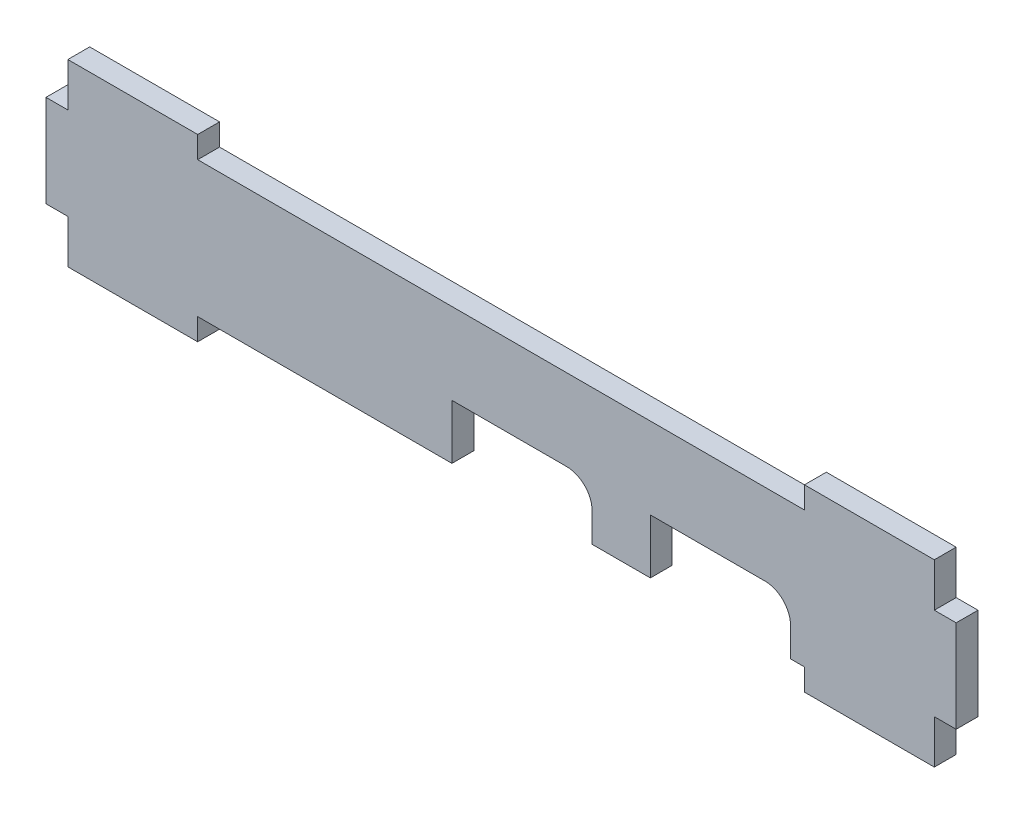
ISO-10303-21;
HEADER;
FILE_DESCRIPTION(('STEP AP214'),'2;1');
FILE_NAME('part.step','',(''),(''),'','','');
FILE_SCHEMA(('AUTOMOTIVE_DESIGN { 1 0 10303 214 1 1 1 1 }'));
ENDSEC;
DATA;
#1=APPLICATION_CONTEXT('core data for automotive mechanical design processes');
#2=APPLICATION_PROTOCOL_DEFINITION('international standard','automotive_design',2000,#1);
#3=PRODUCT_CONTEXT('',#1,'mechanical');
#4=PRODUCT('Part','Part','',(#3));
#5=PRODUCT_RELATED_PRODUCT_CATEGORY('part','',(#4));
#6=PRODUCT_DEFINITION_FORMATION('','',#4);
#7=PRODUCT_DEFINITION_CONTEXT('part definition',#1,'design');
#8=PRODUCT_DEFINITION('design','',#6,#7);
#9=PRODUCT_DEFINITION_SHAPE('','',#8);
#10=(LENGTH_UNIT() NAMED_UNIT(*) SI_UNIT(.MILLI.,.METRE.));
#11=(NAMED_UNIT(*) PLANE_ANGLE_UNIT() SI_UNIT($,.RADIAN.));
#12=(NAMED_UNIT(*) SI_UNIT($,.STERADIAN.) SOLID_ANGLE_UNIT());
#13=UNCERTAINTY_MEASURE_WITH_UNIT(LENGTH_MEASURE(1.E-05),#10,'distance_accuracy_value','');
#14=(GEOMETRIC_REPRESENTATION_CONTEXT(3) GLOBAL_UNCERTAINTY_ASSIGNED_CONTEXT((#13)) GLOBAL_UNIT_ASSIGNED_CONTEXT((#10,
#11,#12)) REPRESENTATION_CONTEXT('',''));
#15=CARTESIAN_POINT('',(0.,0.,0.));
#16=DIRECTION('',(0.,0.,1.));
#17=DIRECTION('',(1.,0.,0.));
#18=AXIS2_PLACEMENT_3D('',#15,#16,#17);
#19=CARTESIAN_POINT('',(166.666666666667,30.6625,3.));
#20=DIRECTION('',(0.,1.,0.));
#21=DIRECTION('',(0.,0.,1.));
#22=AXIS2_PLACEMENT_3D('',#19,#20,#21);
#23=PLANE('',#22);
#24=DIRECTION('',(-1.,0.,0.));
#25=VECTOR('',#24,1.);
#26=CARTESIAN_POINT('',(166.666666666667,30.6625,9.));
#27=LINE('',#26,#25);
#28=CARTESIAN_POINT('',(291.003333333333,30.6625,9.));
#29=VERTEX_POINT('',#28);
#30=CARTESIAN_POINT('',(275.003333333333,30.6625,9.));
#31=VERTEX_POINT('',#30);
#32=EDGE_CURVE('E355',#29,#31,#27,.T.);
#33=ORIENTED_EDGE('',*,*,#32,.T.);
#34=DIRECTION('',(0.,0.,1.));
#35=VECTOR('',#34,1.);
#36=CARTESIAN_POINT('',(275.003333333333,30.6625,3.));
#37=LINE('',#36,#35);
#38=CARTESIAN_POINT('',(275.003333333333,30.6625,3.));
#39=VERTEX_POINT('',#38);
#40=EDGE_CURVE('E264',#39,#31,#37,.T.);
#41=ORIENTED_EDGE('',*,*,#40,.F.);
#42=DIRECTION('',(-1.,0.,0.));
#43=VECTOR('',#42,1.);
#44=CARTESIAN_POINT('',(166.666666666667,30.6625,3.));
#45=LINE('',#44,#43);
#46=CARTESIAN_POINT('',(291.003333333333,30.6625,3.));
#47=VERTEX_POINT('',#46);
#48=EDGE_CURVE('E347',#47,#39,#45,.T.);
#49=ORIENTED_EDGE('',*,*,#48,.F.);
#50=DIRECTION('',(0.,0.,1.));
#51=VECTOR('',#50,1.);
#52=CARTESIAN_POINT('',(291.003333333333,30.6625,3.));
#53=LINE('',#52,#51);
#54=EDGE_CURVE('E284',#47,#29,#53,.T.);
#55=ORIENTED_EDGE('',*,*,#54,.T.);
#56=EDGE_LOOP('',(#33,#41,#49,#55));
#57=FACE_BOUND('',#56,.T.);
#58=ADVANCED_FACE('F34',(#57),#23,.F.);
#59=CARTESIAN_POINT('',(333.333333333333,30.6625,9.));
#60=VERTEX_POINT('',#59);
#61=CARTESIAN_POINT('',(329.503333333333,30.6625,9.));
#62=VERTEX_POINT('',#61);
#63=EDGE_CURVE('E339',#60,#62,#27,.T.);
#64=ORIENTED_EDGE('',*,*,#63,.T.);
#65=DIRECTION('',(0.,0.,1.));
#66=VECTOR('',#65,1.);
#67=CARTESIAN_POINT('',(329.503333333333,30.6625,3.));
#68=LINE('',#67,#66);
#69=CARTESIAN_POINT('',(329.503333333333,30.6625,3.));
#70=VERTEX_POINT('',#69);
#71=EDGE_CURVE('E281',#70,#62,#68,.T.);
#72=ORIENTED_EDGE('',*,*,#71,.F.);
#73=CARTESIAN_POINT('',(333.333333333333,30.6625,3.));
#74=VERTEX_POINT('',#73);
#75=EDGE_CURVE('E343',#74,#70,#45,.T.);
#76=ORIENTED_EDGE('',*,*,#75,.F.);
#77=DIRECTION('',(0.,0.,1.));
#78=VECTOR('',#77,1.);
#79=CARTESIAN_POINT('',(333.333333333333,30.6625,3.));
#80=LINE('',#79,#78);
#81=EDGE_CURVE('E358',#74,#60,#80,.T.);
#82=ORIENTED_EDGE('',*,*,#81,.T.);
#83=EDGE_LOOP('',(#64,#72,#76,#82));
#84=FACE_BOUND('',#83,.T.);
#85=ADVANCED_FACE('F473',(#84),#23,.F.);
#86=CARTESIAN_POINT('',(125.,24.6625,9.));
#87=DIRECTION('',(0.,1.,0.));
#88=DIRECTION('',(0.,0.,1.));
#89=AXIS2_PLACEMENT_3D('',#86,#87,#88);
#90=PLANE('',#89);
#91=DIRECTION('',(1.,0.,0.));
#92=VECTOR('',#91,1.);
#93=CARTESIAN_POINT('',(125.,24.6625,3.));
#94=LINE('',#93,#92);
#95=CARTESIAN_POINT('',(131.,24.6625,3.));
#96=VERTEX_POINT('',#95);
#97=CARTESIAN_POINT('',(166.666666666667,24.6625,3.));
#98=VERTEX_POINT('',#97);
#99=EDGE_CURVE('E439',#96,#98,#94,.T.);
#100=ORIENTED_EDGE('',*,*,#99,.T.);
#101=DIRECTION('',(0.,0.,1.));
#102=VECTOR('',#101,1.);
#103=CARTESIAN_POINT('',(166.666666666667,24.6625,3.));
#104=LINE('',#103,#102);
#105=CARTESIAN_POINT('',(166.666666666667,24.6625,9.));
#106=VERTEX_POINT('',#105);
#107=EDGE_CURVE('E346',#98,#106,#104,.T.);
#108=ORIENTED_EDGE('',*,*,#107,.T.);
#109=DIRECTION('',(1.,0.,0.));
#110=VECTOR('',#109,1.);
#111=CARTESIAN_POINT('',(125.,24.6625,9.));
#112=LINE('',#111,#110);
#113=CARTESIAN_POINT('',(131.,24.6625,9.));
#114=VERTEX_POINT('',#113);
#115=EDGE_CURVE('E426',#114,#106,#112,.T.);
#116=ORIENTED_EDGE('',*,*,#115,.F.);
#117=DIRECTION('',(0.,0.,1.));
#118=VECTOR('',#117,1.);
#119=CARTESIAN_POINT('',(131.,24.6625,3.));
#120=LINE('',#119,#118);
#121=EDGE_CURVE('E391',#96,#114,#120,.T.);
#122=ORIENTED_EDGE('',*,*,#121,.F.);
#123=EDGE_LOOP('',(#100,#108,#116,#122));
#124=FACE_BOUND('',#123,.T.);
#125=ADVANCED_FACE('F480',(#124),#90,.F.);
#126=CARTESIAN_POINT('',(125.,73.9875,9.));
#127=DIRECTION('',(0.,-1.,0.));
#128=DIRECTION('',(0.,0.,-1.));
#129=AXIS2_PLACEMENT_3D('',#126,#127,#128);
#130=PLANE('',#129);
#131=DIRECTION('',(-1.,0.,0.));
#132=VECTOR('',#131,1.);
#133=CARTESIAN_POINT('',(125.,73.9875,9.));
#134=LINE('',#133,#132);
#135=CARTESIAN_POINT('',(166.666666666667,73.9875,9.));
#136=VERTEX_POINT('',#135);
#137=CARTESIAN_POINT('',(131.,73.9875,9.));
#138=VERTEX_POINT('',#137);
#139=EDGE_CURVE('E429',#136,#138,#134,.T.);
#140=ORIENTED_EDGE('',*,*,#139,.F.);
#141=DIRECTION('',(0.,0.,1.));
#142=VECTOR('',#141,1.);
#143=CARTESIAN_POINT('',(166.666666666667,73.9875,3.));
#144=LINE('',#143,#142);
#145=CARTESIAN_POINT('',(166.666666666667,73.9875,3.));
#146=VERTEX_POINT('',#145);
#147=EDGE_CURVE('E300',#146,#136,#144,.T.);
#148=ORIENTED_EDGE('',*,*,#147,.F.);
#149=DIRECTION('',(-1.,0.,0.));
#150=VECTOR('',#149,1.);
#151=CARTESIAN_POINT('',(125.,73.9875,3.));
#152=LINE('',#151,#150);
#153=CARTESIAN_POINT('',(131.,73.9875,3.));
#154=VERTEX_POINT('',#153);
#155=EDGE_CURVE('E442',#146,#154,#152,.T.);
#156=ORIENTED_EDGE('',*,*,#155,.T.);
#157=DIRECTION('',(0.,0.,1.));
#158=VECTOR('',#157,1.);
#159=CARTESIAN_POINT('',(131.,73.9875,3.));
#160=LINE('',#159,#158);
#161=EDGE_CURVE('E302',#154,#138,#160,.T.);
#162=ORIENTED_EDGE('',*,*,#161,.T.);
#163=EDGE_LOOP('',(#140,#148,#156,#162));
#164=FACE_BOUND('',#163,.T.);
#165=ADVANCED_FACE('F535',(#164),#130,.F.);
#166=CARTESIAN_POINT('',(125.,24.6625,9.));
#167=DIRECTION('',(1.,0.,0.));
#168=DIRECTION('',(0.,0.,-1.));
#169=AXIS2_PLACEMENT_3D('',#166,#167,#168);
#170=PLANE('',#169);
#171=DIRECTION('',(0.,-1.,0.));
#172=VECTOR('',#171,1.);
#173=CARTESIAN_POINT('',(125.,24.6625,9.));
#174=LINE('',#173,#172);
#175=CARTESIAN_POINT('',(125.,61.9875,9.));
#176=VERTEX_POINT('',#175);
#177=CARTESIAN_POINT('',(125.,36.6625,9.));
#178=VERTEX_POINT('',#177);
#179=EDGE_CURVE('E419',#176,#178,#174,.T.);
#180=ORIENTED_EDGE('',*,*,#179,.F.);
#181=DIRECTION('',(0.,0.,1.));
#182=VECTOR('',#181,1.);
#183=CARTESIAN_POINT('',(125.,61.9875,3.));
#184=LINE('',#183,#182);
#185=CARTESIAN_POINT('',(125.,61.9875,3.));
#186=VERTEX_POINT('',#185);
#187=EDGE_CURVE('E296',#186,#176,#184,.T.);
#188=ORIENTED_EDGE('',*,*,#187,.F.);
#189=DIRECTION('',(0.,-1.,0.));
#190=VECTOR('',#189,1.);
#191=CARTESIAN_POINT('',(125.,24.6625,3.));
#192=LINE('',#191,#190);
#193=CARTESIAN_POINT('',(125.,36.6625,3.));
#194=VERTEX_POINT('',#193);
#195=EDGE_CURVE('E415',#186,#194,#192,.T.);
#196=ORIENTED_EDGE('',*,*,#195,.T.);
#197=DIRECTION('',(0.,0.,1.));
#198=VECTOR('',#197,1.);
#199=CARTESIAN_POINT('',(125.,36.6625,3.));
#200=LINE('',#199,#198);
#201=EDGE_CURVE('E375',#194,#178,#200,.T.);
#202=ORIENTED_EDGE('',*,*,#201,.T.);
#203=EDGE_LOOP('',(#180,#188,#196,#202));
#204=FACE_BOUND('',#203,.T.);
#205=ADVANCED_FACE('F521',(#204),#170,.F.);
#206=CARTESIAN_POINT('',(333.333333333333,24.6625,9.));
#207=VERTEX_POINT('',#206);
#208=CARTESIAN_POINT('',(369.,24.6625,9.));
#209=VERTEX_POINT('',#208);
#210=EDGE_CURVE('E422',#207,#209,#112,.T.);
#211=ORIENTED_EDGE('',*,*,#210,.F.);
#212=DIRECTION('',(0.,0.,1.));
#213=VECTOR('',#212,1.);
#214=CARTESIAN_POINT('',(333.333333333333,24.6625,3.));
#215=LINE('',#214,#213);
#216=CARTESIAN_POINT('',(333.333333333333,24.6625,3.));
#217=VERTEX_POINT('',#216);
#218=EDGE_CURVE('E360',#217,#207,#215,.T.);
#219=ORIENTED_EDGE('',*,*,#218,.F.);
#220=CARTESIAN_POINT('',(369.,24.6625,3.));
#221=VERTEX_POINT('',#220);
#222=EDGE_CURVE('E436',#217,#221,#94,.T.);
#223=ORIENTED_EDGE('',*,*,#222,.T.);
#224=DIRECTION('',(0.,0.,1.));
#225=VECTOR('',#224,1.);
#226=CARTESIAN_POINT('',(369.,24.6625,3.));
#227=LINE('',#226,#225);
#228=EDGE_CURVE('E377',#221,#209,#227,.T.);
#229=ORIENTED_EDGE('',*,*,#228,.T.);
#230=EDGE_LOOP('',(#211,#219,#223,#229));
#231=FACE_BOUND('',#230,.T.);
#232=ADVANCED_FACE('F573',(#231),#90,.F.);
#233=CARTESIAN_POINT('',(375.,24.6625,9.));
#234=DIRECTION('',(-1.,0.,0.));
#235=DIRECTION('',(0.,0.,1.));
#236=AXIS2_PLACEMENT_3D('',#233,#234,#235);
#237=PLANE('',#236);
#238=DIRECTION('',(0.,1.,0.));
#239=VECTOR('',#238,1.);
#240=CARTESIAN_POINT('',(375.,24.6625,9.));
#241=LINE('',#240,#239);
#242=CARTESIAN_POINT('',(375.,36.6625,9.));
#243=VERTEX_POINT('',#242);
#244=CARTESIAN_POINT('',(375.,61.9875,9.));
#245=VERTEX_POINT('',#244);
#246=EDGE_CURVE('E427',#243,#245,#241,.T.);
#247=ORIENTED_EDGE('',*,*,#246,.F.);
#248=DIRECTION('',(0.,0.,1.));
#249=VECTOR('',#248,1.);
#250=CARTESIAN_POINT('',(375.,36.6625,3.));
#251=LINE('',#250,#249);
#252=CARTESIAN_POINT('',(375.,36.6625,3.));
#253=VERTEX_POINT('',#252);
#254=EDGE_CURVE('E371',#253,#243,#251,.T.);
#255=ORIENTED_EDGE('',*,*,#254,.F.);
#256=DIRECTION('',(0.,1.,0.));
#257=VECTOR('',#256,1.);
#258=CARTESIAN_POINT('',(375.,24.6625,3.));
#259=LINE('',#258,#257);
#260=CARTESIAN_POINT('',(375.,61.9875,3.));
#261=VERTEX_POINT('',#260);
#262=EDGE_CURVE('E440',#253,#261,#259,.T.);
#263=ORIENTED_EDGE('',*,*,#262,.T.);
#264=DIRECTION('',(0.,0.,1.));
#265=VECTOR('',#264,1.);
#266=CARTESIAN_POINT('',(375.,61.9875,3.));
#267=LINE('',#266,#265);
#268=EDGE_CURVE('E412',#261,#245,#267,.T.);
#269=ORIENTED_EDGE('',*,*,#268,.T.);
#270=EDGE_LOOP('',(#247,#255,#263,#269));
#271=FACE_BOUND('',#270,.T.);
#272=ADVANCED_FACE('F561',(#271),#237,.F.);
#273=CARTESIAN_POINT('',(369.,73.9875,3.));
#274=VERTEX_POINT('',#273);
#275=CARTESIAN_POINT('',(333.333333333333,73.9875,3.));
#276=VERTEX_POINT('',#275);
#277=EDGE_CURVE('E423',#274,#276,#152,.T.);
#278=ORIENTED_EDGE('',*,*,#277,.T.);
#279=DIRECTION('',(0.,0.,1.));
#280=VECTOR('',#279,1.);
#281=CARTESIAN_POINT('',(333.333333333333,73.9875,3.));
#282=LINE('',#281,#280);
#283=CARTESIAN_POINT('',(333.333333333333,73.9875,9.));
#284=VERTEX_POINT('',#283);
#285=EDGE_CURVE('E329',#276,#284,#282,.T.);
#286=ORIENTED_EDGE('',*,*,#285,.T.);
#287=CARTESIAN_POINT('',(369.,73.9875,9.));
#288=VERTEX_POINT('',#287);
#289=EDGE_CURVE('E430',#288,#284,#134,.T.);
#290=ORIENTED_EDGE('',*,*,#289,.F.);
#291=DIRECTION('',(0.,0.,1.));
#292=VECTOR('',#291,1.);
#293=CARTESIAN_POINT('',(369.,73.9875,3.));
#294=LINE('',#293,#292);
#295=EDGE_CURVE('E407',#274,#288,#294,.T.);
#296=ORIENTED_EDGE('',*,*,#295,.F.);
#297=EDGE_LOOP('',(#278,#286,#290,#296));
#298=FACE_BOUND('',#297,.T.);
#299=ADVANCED_FACE('F548',(#298),#130,.F.);
#300=CARTESIAN_POINT('',(125.,24.6625,9.));
#301=DIRECTION('',(0.,0.,-1.));
#302=DIRECTION('',(-1.,0.,0.));
#303=AXIS2_PLACEMENT_3D('',#300,#301,#302);
#304=PLANE('',#303);
#305=DIRECTION('',(-1.,0.,0.));
#306=VECTOR('',#305,1.);
#307=CARTESIAN_POINT('',(275.003333333333,45.6625,9.));
#308=LINE('',#307,#306);
#309=CARTESIAN_POINT('',(268.003333333333,45.6625,9.));
#310=VERTEX_POINT('',#309);
#311=CARTESIAN_POINT('',(236.503333333333,45.6625,9.));
#312=VERTEX_POINT('',#311);
#313=EDGE_CURVE('E248',#310,#312,#308,.T.);
#314=ORIENTED_EDGE('',*,*,#313,.F.);
#315=CARTESIAN_POINT('',(268.003333333333,38.6625,9.));
#316=DIRECTION('',(0.,0.,-1.));
#317=DIRECTION('',(-1.,0.,0.));
#318=AXIS2_PLACEMENT_3D('',#315,#316,#317);
#319=CIRCLE('',#318,7.);
#320=CARTESIAN_POINT('',(275.003333333333,38.6625,9.));
#321=VERTEX_POINT('',#320);
#322=EDGE_CURVE('E452',#310,#321,#319,.T.);
#323=ORIENTED_EDGE('',*,*,#322,.T.);
#324=DIRECTION('',(0.,1.,0.));
#325=VECTOR('',#324,1.);
#326=CARTESIAN_POINT('',(275.003333333333,30.6625,9.));
#327=LINE('',#326,#325);
#328=EDGE_CURVE('E258',#31,#321,#327,.T.);
#329=ORIENTED_EDGE('',*,*,#328,.F.);
#330=ORIENTED_EDGE('',*,*,#32,.F.);
#331=DIRECTION('',(0.,-1.,0.));
#332=VECTOR('',#331,1.);
#333=CARTESIAN_POINT('',(291.003333333333,30.6625,9.));
#334=LINE('',#333,#332);
#335=CARTESIAN_POINT('',(291.003333333333,45.6625,9.));
#336=VERTEX_POINT('',#335);
#337=EDGE_CURVE('E271',#336,#29,#334,.T.);
#338=ORIENTED_EDGE('',*,*,#337,.F.);
#339=DIRECTION('',(-1.,0.,0.));
#340=VECTOR('',#339,1.);
#341=CARTESIAN_POINT('',(329.503333333333,45.6625,9.));
#342=LINE('',#341,#340);
#343=CARTESIAN_POINT('',(322.503333333333,45.6625,9.));
#344=VERTEX_POINT('',#343);
#345=EDGE_CURVE('E278',#344,#336,#342,.T.);
#346=ORIENTED_EDGE('',*,*,#345,.F.);
#347=CARTESIAN_POINT('',(322.503333333333,38.6625,9.));
#348=DIRECTION('',(0.,0.,-1.));
#349=DIRECTION('',(-1.,0.,0.));
#350=AXIS2_PLACEMENT_3D('',#347,#348,#349);
#351=CIRCLE('',#350,7.);
#352=CARTESIAN_POINT('',(329.503333333333,38.6625,9.));
#353=VERTEX_POINT('',#352);
#354=EDGE_CURVE('E42',#344,#353,#351,.T.);
#355=ORIENTED_EDGE('',*,*,#354,.T.);
#356=DIRECTION('',(0.,1.,0.));
#357=VECTOR('',#356,1.);
#358=CARTESIAN_POINT('',(329.503333333333,30.6625,9.));
#359=LINE('',#358,#357);
#360=EDGE_CURVE('E266',#62,#353,#359,.T.);
#361=ORIENTED_EDGE('',*,*,#360,.F.);
#362=ORIENTED_EDGE('',*,*,#63,.F.);
#363=DIRECTION('',(0.,1.,0.));
#364=VECTOR('',#363,1.);
#365=CARTESIAN_POINT('',(333.333333333333,24.6625,9.));
#366=LINE('',#365,#364);
#367=EDGE_CURVE('E349',#207,#60,#366,.T.);
#368=ORIENTED_EDGE('',*,*,#367,.F.);
#369=ORIENTED_EDGE('',*,*,#210,.T.);
#370=DIRECTION('',(0.,-1.,0.));
#371=VECTOR('',#370,1.);
#372=CARTESIAN_POINT('',(369.,24.6625,9.));
#373=LINE('',#372,#371);
#374=CARTESIAN_POINT('',(369.,36.6625,9.));
#375=VERTEX_POINT('',#374);
#376=EDGE_CURVE('E368',#375,#209,#373,.T.);
#377=ORIENTED_EDGE('',*,*,#376,.F.);
#378=DIRECTION('',(-1.,0.,0.));
#379=VECTOR('',#378,1.);
#380=CARTESIAN_POINT('',(375.,36.6625,9.));
#381=LINE('',#380,#379);
#382=EDGE_CURVE('E372',#243,#375,#381,.T.);
#383=ORIENTED_EDGE('',*,*,#382,.F.);
#384=ORIENTED_EDGE('',*,*,#246,.T.);
#385=DIRECTION('',(1.,0.,0.));
#386=VECTOR('',#385,1.);
#387=CARTESIAN_POINT('',(375.,61.9875,9.));
#388=LINE('',#387,#386);
#389=CARTESIAN_POINT('',(369.,61.9875,9.));
#390=VERTEX_POINT('',#389);
#391=EDGE_CURVE('E404',#390,#245,#388,.T.);
#392=ORIENTED_EDGE('',*,*,#391,.F.);
#393=DIRECTION('',(0.,-1.,0.));
#394=VECTOR('',#393,1.);
#395=CARTESIAN_POINT('',(369.,73.9875,9.));
#396=LINE('',#395,#394);
#397=EDGE_CURVE('E380',#288,#390,#396,.T.);
#398=ORIENTED_EDGE('',*,*,#397,.F.);
#399=ORIENTED_EDGE('',*,*,#289,.T.);
#400=DIRECTION('',(0.,1.,0.));
#401=VECTOR('',#400,1.);
#402=CARTESIAN_POINT('',(333.333333333333,73.9875,9.));
#403=LINE('',#402,#401);
#404=CARTESIAN_POINT('',(333.333333333333,67.9875,9.));
#405=VERTEX_POINT('',#404);
#406=EDGE_CURVE('E313',#405,#284,#403,.T.);
#407=ORIENTED_EDGE('',*,*,#406,.F.);
#408=DIRECTION('',(1.,0.,0.));
#409=VECTOR('',#408,1.);
#410=CARTESIAN_POINT('',(166.666666666667,67.9875,9.));
#411=LINE('',#410,#409);
#412=CARTESIAN_POINT('',(166.666666666667,67.9875,9.));
#413=VERTEX_POINT('',#412);
#414=EDGE_CURVE('E323',#413,#405,#411,.T.);
#415=ORIENTED_EDGE('',*,*,#414,.F.);
#416=DIRECTION('',(0.,-1.,0.));
#417=VECTOR('',#416,1.);
#418=CARTESIAN_POINT('',(166.666666666667,73.9875,9.));
#419=LINE('',#418,#417);
#420=EDGE_CURVE('E320',#136,#413,#419,.T.);
#421=ORIENTED_EDGE('',*,*,#420,.F.);
#422=ORIENTED_EDGE('',*,*,#139,.T.);
#423=DIRECTION('',(0.,1.,0.));
#424=VECTOR('',#423,1.);
#425=CARTESIAN_POINT('',(131.,73.9875,9.));
#426=LINE('',#425,#424);
#427=CARTESIAN_POINT('',(131.,61.9875,9.));
#428=VERTEX_POINT('',#427);
#429=EDGE_CURVE('E293',#428,#138,#426,.T.);
#430=ORIENTED_EDGE('',*,*,#429,.F.);
#431=DIRECTION('',(1.,0.,0.));
#432=VECTOR('',#431,1.);
#433=CARTESIAN_POINT('',(125.,61.9875,9.));
#434=LINE('',#433,#432);
#435=EDGE_CURVE('E297',#176,#428,#434,.T.);
#436=ORIENTED_EDGE('',*,*,#435,.F.);
#437=ORIENTED_EDGE('',*,*,#179,.T.);
#438=DIRECTION('',(-1.,0.,0.));
#439=VECTOR('',#438,1.);
#440=CARTESIAN_POINT('',(125.,36.6625,9.));
#441=LINE('',#440,#439);
#442=CARTESIAN_POINT('',(131.,36.6625,9.));
#443=VERTEX_POINT('',#442);
#444=EDGE_CURVE('E388',#443,#178,#441,.T.);
#445=ORIENTED_EDGE('',*,*,#444,.F.);
#446=DIRECTION('',(0.,1.,0.));
#447=VECTOR('',#446,1.);
#448=CARTESIAN_POINT('',(131.,24.6625,9.));
#449=LINE('',#448,#447);
#450=EDGE_CURVE('E305',#114,#443,#449,.T.);
#451=ORIENTED_EDGE('',*,*,#450,.F.);
#452=ORIENTED_EDGE('',*,*,#115,.T.);
#453=DIRECTION('',(0.,-1.,0.));
#454=VECTOR('',#453,1.);
#455=CARTESIAN_POINT('',(166.666666666667,24.6625,9.));
#456=LINE('',#455,#454);
#457=CARTESIAN_POINT('',(166.666666666667,30.6625,9.));
#458=VERTEX_POINT('',#457);
#459=EDGE_CURVE('E283',#458,#106,#456,.T.);
#460=ORIENTED_EDGE('',*,*,#459,.F.);
#461=CARTESIAN_POINT('',(236.503333333333,30.6625,9.));
#462=VERTEX_POINT('',#461);
#463=EDGE_CURVE('E352',#462,#458,#27,.T.);
#464=ORIENTED_EDGE('',*,*,#463,.F.);
#465=DIRECTION('',(0.,-1.,0.));
#466=VECTOR('',#465,1.);
#467=CARTESIAN_POINT('',(236.503333333333,30.6625,9.));
#468=LINE('',#467,#466);
#469=EDGE_CURVE('E262',#312,#462,#468,.T.);
#470=ORIENTED_EDGE('',*,*,#469,.F.);
#471=EDGE_LOOP('',(#314,#323,#329,#330,#338,#346,#355,#361,#362,#368,#369,#377,#383,#384,#392,
#398,#399,#407,#415,#421,#422,#430,#436,#437,#445,#451,#452,#460,#464,#470));
#472=FACE_BOUND('',#471,.T.);
#473=ADVANCED_FACE('F455',(#472),#304,.F.);
#474=CARTESIAN_POINT('',(125.,24.6625,3.));
#475=DIRECTION('',(0.,0.,-1.));
#476=DIRECTION('',(-1.,0.,0.));
#477=AXIS2_PLACEMENT_3D('',#474,#475,#476);
#478=PLANE('',#477);
#479=DIRECTION('',(0.,1.,0.));
#480=VECTOR('',#479,1.);
#481=CARTESIAN_POINT('',(275.003333333333,30.6625,3.));
#482=LINE('',#481,#480);
#483=CARTESIAN_POINT('',(275.003333333333,38.6625,3.));
#484=VERTEX_POINT('',#483);
#485=EDGE_CURVE('E242',#39,#484,#482,.T.);
#486=ORIENTED_EDGE('',*,*,#485,.T.);
#487=CARTESIAN_POINT('',(268.003333333333,38.6625,3.));
#488=DIRECTION('',(0.,0.,-1.));
#489=DIRECTION('',(-1.,0.,0.));
#490=AXIS2_PLACEMENT_3D('',#487,#488,#489);
#491=CIRCLE('',#490,7.);
#492=CARTESIAN_POINT('',(268.003333333333,45.6625,3.));
#493=VERTEX_POINT('',#492);
#494=EDGE_CURVE('E238',#484,#493,#491,.F.);
#495=ORIENTED_EDGE('',*,*,#494,.T.);
#496=DIRECTION('',(-1.,0.,0.));
#497=VECTOR('',#496,1.);
#498=CARTESIAN_POINT('',(275.003333333333,45.6625,3.));
#499=LINE('',#498,#497);
#500=CARTESIAN_POINT('',(236.503333333333,45.6625,3.));
#501=VERTEX_POINT('',#500);
#502=EDGE_CURVE('E230',#493,#501,#499,.T.);
#503=ORIENTED_EDGE('',*,*,#502,.T.);
#504=DIRECTION('',(0.,-1.,0.));
#505=VECTOR('',#504,1.);
#506=CARTESIAN_POINT('',(236.503333333333,30.6625,3.));
#507=LINE('',#506,#505);
#508=CARTESIAN_POINT('',(236.503333333333,30.6625,3.));
#509=VERTEX_POINT('',#508);
#510=EDGE_CURVE('E235',#501,#509,#507,.T.);
#511=ORIENTED_EDGE('',*,*,#510,.T.);
#512=CARTESIAN_POINT('',(166.666666666667,30.6625,3.));
#513=VERTEX_POINT('',#512);
#514=EDGE_CURVE('E342',#509,#513,#45,.T.);
#515=ORIENTED_EDGE('',*,*,#514,.T.);
#516=DIRECTION('',(0.,-1.,0.));
#517=VECTOR('',#516,1.);
#518=CARTESIAN_POINT('',(166.666666666667,24.6625,3.));
#519=LINE('',#518,#517);
#520=EDGE_CURVE('E335',#513,#98,#519,.T.);
#521=ORIENTED_EDGE('',*,*,#520,.T.);
#522=ORIENTED_EDGE('',*,*,#99,.F.);
#523=DIRECTION('',(0.,1.,0.));
#524=VECTOR('',#523,1.);
#525=CARTESIAN_POINT('',(131.,24.6625,3.));
#526=LINE('',#525,#524);
#527=CARTESIAN_POINT('',(131.,36.6625,3.));
#528=VERTEX_POINT('',#527);
#529=EDGE_CURVE('E384',#96,#528,#526,.T.);
#530=ORIENTED_EDGE('',*,*,#529,.T.);
#531=DIRECTION('',(-1.,0.,0.));
#532=VECTOR('',#531,1.);
#533=CARTESIAN_POINT('',(125.,36.6625,3.));
#534=LINE('',#533,#532);
#535=EDGE_CURVE('E387',#528,#194,#534,.T.);
#536=ORIENTED_EDGE('',*,*,#535,.T.);
#537=ORIENTED_EDGE('',*,*,#195,.F.);
#538=DIRECTION('',(1.,0.,0.));
#539=VECTOR('',#538,1.);
#540=CARTESIAN_POINT('',(125.,61.9875,3.));
#541=LINE('',#540,#539);
#542=CARTESIAN_POINT('',(131.,61.9875,3.));
#543=VERTEX_POINT('',#542);
#544=EDGE_CURVE('E289',#186,#543,#541,.T.);
#545=ORIENTED_EDGE('',*,*,#544,.T.);
#546=DIRECTION('',(0.,1.,0.));
#547=VECTOR('',#546,1.);
#548=CARTESIAN_POINT('',(131.,73.9875,3.));
#549=LINE('',#548,#547);
#550=EDGE_CURVE('E292',#543,#154,#549,.T.);
#551=ORIENTED_EDGE('',*,*,#550,.T.);
#552=ORIENTED_EDGE('',*,*,#155,.F.);
#553=DIRECTION('',(0.,-1.,0.));
#554=VECTOR('',#553,1.);
#555=CARTESIAN_POINT('',(166.666666666667,73.9875,3.));
#556=LINE('',#555,#554);
#557=CARTESIAN_POINT('',(166.666666666667,67.9875,3.));
#558=VERTEX_POINT('',#557);
#559=EDGE_CURVE('E309',#146,#558,#556,.T.);
#560=ORIENTED_EDGE('',*,*,#559,.T.);
#561=DIRECTION('',(1.,0.,0.));
#562=VECTOR('',#561,1.);
#563=CARTESIAN_POINT('',(166.666666666667,67.9875,3.));
#564=LINE('',#563,#562);
#565=CARTESIAN_POINT('',(333.333333333333,67.9875,3.));
#566=VERTEX_POINT('',#565);
#567=EDGE_CURVE('E312',#558,#566,#564,.T.);
#568=ORIENTED_EDGE('',*,*,#567,.T.);
#569=DIRECTION('',(0.,1.,0.));
#570=VECTOR('',#569,1.);
#571=CARTESIAN_POINT('',(333.333333333333,73.9875,3.));
#572=LINE('',#571,#570);
#573=EDGE_CURVE('E316',#566,#276,#572,.T.);
#574=ORIENTED_EDGE('',*,*,#573,.T.);
#575=ORIENTED_EDGE('',*,*,#277,.F.);
#576=DIRECTION('',(0.,-1.,0.));
#577=VECTOR('',#576,1.);
#578=CARTESIAN_POINT('',(369.,73.9875,3.));
#579=LINE('',#578,#577);
#580=CARTESIAN_POINT('',(369.,61.9875,3.));
#581=VERTEX_POINT('',#580);
#582=EDGE_CURVE('E400',#274,#581,#579,.T.);
#583=ORIENTED_EDGE('',*,*,#582,.T.);
#584=DIRECTION('',(1.,0.,0.));
#585=VECTOR('',#584,1.);
#586=CARTESIAN_POINT('',(375.,61.9875,3.));
#587=LINE('',#586,#585);
#588=EDGE_CURVE('E403',#581,#261,#587,.T.);
#589=ORIENTED_EDGE('',*,*,#588,.T.);
#590=ORIENTED_EDGE('',*,*,#262,.F.);
#591=DIRECTION('',(-1.,0.,0.));
#592=VECTOR('',#591,1.);
#593=CARTESIAN_POINT('',(375.,36.6625,3.));
#594=LINE('',#593,#592);
#595=CARTESIAN_POINT('',(369.,36.6625,3.));
#596=VERTEX_POINT('',#595);
#597=EDGE_CURVE('E364',#253,#596,#594,.T.);
#598=ORIENTED_EDGE('',*,*,#597,.T.);
#599=DIRECTION('',(0.,-1.,0.));
#600=VECTOR('',#599,1.);
#601=CARTESIAN_POINT('',(369.,24.6625,3.));
#602=LINE('',#601,#600);
#603=EDGE_CURVE('E367',#596,#221,#602,.T.);
#604=ORIENTED_EDGE('',*,*,#603,.T.);
#605=ORIENTED_EDGE('',*,*,#222,.F.);
#606=DIRECTION('',(0.,1.,0.));
#607=VECTOR('',#606,1.);
#608=CARTESIAN_POINT('',(333.333333333333,24.6625,3.));
#609=LINE('',#608,#607);
#610=EDGE_CURVE('E338',#217,#74,#609,.T.);
#611=ORIENTED_EDGE('',*,*,#610,.T.);
#612=ORIENTED_EDGE('',*,*,#75,.T.);
#613=DIRECTION('',(0.,1.,0.));
#614=VECTOR('',#613,1.);
#615=CARTESIAN_POINT('',(329.503333333333,30.6625,3.));
#616=LINE('',#615,#614);
#617=CARTESIAN_POINT('',(329.503333333333,38.6625,3.));
#618=VERTEX_POINT('',#617);
#619=EDGE_CURVE('E268',#70,#618,#616,.T.);
#620=ORIENTED_EDGE('',*,*,#619,.T.);
#621=CARTESIAN_POINT('',(322.503333333333,38.6625,3.));
#622=DIRECTION('',(0.,0.,-1.));
#623=DIRECTION('',(-1.,0.,0.));
#624=AXIS2_PLACEMENT_3D('',#621,#622,#623);
#625=CIRCLE('',#624,7.);
#626=CARTESIAN_POINT('',(322.503333333333,45.6625,3.));
#627=VERTEX_POINT('',#626);
#628=EDGE_CURVE('E11',#618,#627,#625,.F.);
#629=ORIENTED_EDGE('',*,*,#628,.T.);
#630=DIRECTION('',(-1.,0.,0.));
#631=VECTOR('',#630,1.);
#632=CARTESIAN_POINT('',(329.503333333333,45.6625,3.));
#633=LINE('',#632,#631);
#634=CARTESIAN_POINT('',(291.003333333333,45.6625,3.));
#635=VERTEX_POINT('',#634);
#636=EDGE_CURVE('E270',#627,#635,#633,.T.);
#637=ORIENTED_EDGE('',*,*,#636,.T.);
#638=DIRECTION('',(0.,-1.,0.));
#639=VECTOR('',#638,1.);
#640=CARTESIAN_POINT('',(291.003333333333,30.6625,3.));
#641=LINE('',#640,#639);
#642=EDGE_CURVE('E273',#635,#47,#641,.T.);
#643=ORIENTED_EDGE('',*,*,#642,.T.);
#644=ORIENTED_EDGE('',*,*,#48,.T.);
#645=EDGE_LOOP('',(#486,#495,#503,#511,#515,#521,#522,#530,#536,#537,#545,#551,#552,#560,#568,
#574,#575,#583,#589,#590,#598,#604,#605,#611,#612,#620,#629,#637,#643,#644));
#646=FACE_BOUND('',#645,.T.);
#647=ADVANCED_FACE('F233',(#646),#478,.T.);
#648=CARTESIAN_POINT('',(375.,61.9875,3.));
#649=DIRECTION('',(0.,-1.,0.));
#650=DIRECTION('',(0.,0.,-1.));
#651=AXIS2_PLACEMENT_3D('',#648,#649,#650);
#652=PLANE('',#651);
#653=ORIENTED_EDGE('',*,*,#391,.T.);
#654=ORIENTED_EDGE('',*,*,#268,.F.);
#655=ORIENTED_EDGE('',*,*,#588,.F.);
#656=DIRECTION('',(0.,0.,1.));
#657=VECTOR('',#656,1.);
#658=CARTESIAN_POINT('',(369.,61.9875,3.));
#659=LINE('',#658,#657);
#660=EDGE_CURVE('E416',#581,#390,#659,.T.);
#661=ORIENTED_EDGE('',*,*,#660,.T.);
#662=EDGE_LOOP('',(#653,#654,#655,#661));
#663=FACE_BOUND('',#662,.T.);
#664=ADVANCED_FACE('F559',(#663),#652,.F.);
#665=CARTESIAN_POINT('',(369.,73.9875,3.));
#666=DIRECTION('',(-1.,0.,0.));
#667=DIRECTION('',(0.,0.,1.));
#668=AXIS2_PLACEMENT_3D('',#665,#666,#667);
#669=PLANE('',#668);
#670=ORIENTED_EDGE('',*,*,#397,.T.);
#671=ORIENTED_EDGE('',*,*,#660,.F.);
#672=ORIENTED_EDGE('',*,*,#582,.F.);
#673=ORIENTED_EDGE('',*,*,#295,.T.);
#674=EDGE_LOOP('',(#670,#671,#672,#673));
#675=FACE_BOUND('',#674,.T.);
#676=ADVANCED_FACE('F552',(#675),#669,.F.);
#677=CARTESIAN_POINT('',(369.,24.6625,3.));
#678=DIRECTION('',(-1.,0.,0.));
#679=DIRECTION('',(0.,0.,1.));
#680=AXIS2_PLACEMENT_3D('',#677,#678,#679);
#681=PLANE('',#680);
#682=ORIENTED_EDGE('',*,*,#376,.T.);
#683=ORIENTED_EDGE('',*,*,#228,.F.);
#684=ORIENTED_EDGE('',*,*,#603,.F.);
#685=DIRECTION('',(0.,0.,1.));
#686=VECTOR('',#685,1.);
#687=CARTESIAN_POINT('',(369.,36.6625,3.));
#688=LINE('',#687,#686);
#689=EDGE_CURVE('E381',#596,#375,#688,.T.);
#690=ORIENTED_EDGE('',*,*,#689,.T.);
#691=EDGE_LOOP('',(#682,#683,#684,#690));
#692=FACE_BOUND('',#691,.T.);
#693=ADVANCED_FACE('F570',(#692),#681,.F.);
#694=CARTESIAN_POINT('',(375.,36.6625,3.));
#695=DIRECTION('',(0.,1.,0.));
#696=DIRECTION('',(0.,0.,1.));
#697=AXIS2_PLACEMENT_3D('',#694,#695,#696);
#698=PLANE('',#697);
#699=ORIENTED_EDGE('',*,*,#382,.T.);
#700=ORIENTED_EDGE('',*,*,#689,.F.);
#701=ORIENTED_EDGE('',*,*,#597,.F.);
#702=ORIENTED_EDGE('',*,*,#254,.T.);
#703=EDGE_LOOP('',(#699,#700,#701,#702));
#704=FACE_BOUND('',#703,.T.);
#705=ADVANCED_FACE('F567',(#704),#698,.F.);
#706=CARTESIAN_POINT('',(125.,36.6625,3.));
#707=DIRECTION('',(0.,1.,0.));
#708=DIRECTION('',(0.,0.,1.));
#709=AXIS2_PLACEMENT_3D('',#706,#707,#708);
#710=PLANE('',#709);
#711=ORIENTED_EDGE('',*,*,#444,.T.);
#712=ORIENTED_EDGE('',*,*,#201,.F.);
#713=ORIENTED_EDGE('',*,*,#535,.F.);
#714=DIRECTION('',(0.,0.,1.));
#715=VECTOR('',#714,1.);
#716=CARTESIAN_POINT('',(131.,36.6625,3.));
#717=LINE('',#716,#715);
#718=EDGE_CURVE('E397',#528,#443,#717,.T.);
#719=ORIENTED_EDGE('',*,*,#718,.T.);
#720=EDGE_LOOP('',(#711,#712,#713,#719));
#721=FACE_BOUND('',#720,.T.);
#722=ADVANCED_FACE('F518',(#721),#710,.F.);
#723=CARTESIAN_POINT('',(131.,24.6625,3.));
#724=DIRECTION('',(1.,0.,0.));
#725=DIRECTION('',(0.,1.,0.));
#726=AXIS2_PLACEMENT_3D('',#723,#724,#725);
#727=PLANE('',#726);
#728=ORIENTED_EDGE('',*,*,#450,.T.);
#729=ORIENTED_EDGE('',*,*,#718,.F.);
#730=ORIENTED_EDGE('',*,*,#529,.F.);
#731=ORIENTED_EDGE('',*,*,#121,.T.);
#732=EDGE_LOOP('',(#728,#729,#730,#731));
#733=FACE_BOUND('',#732,.T.);
#734=ADVANCED_FACE('F516',(#733),#727,.F.);
#735=CARTESIAN_POINT('',(131.,73.9875,3.));
#736=DIRECTION('',(1.,0.,0.));
#737=DIRECTION('',(0.,0.,-1.));
#738=AXIS2_PLACEMENT_3D('',#735,#736,#737);
#739=PLANE('',#738);
#740=ORIENTED_EDGE('',*,*,#429,.T.);
#741=ORIENTED_EDGE('',*,*,#161,.F.);
#742=ORIENTED_EDGE('',*,*,#550,.F.);
#743=DIRECTION('',(0.,0.,1.));
#744=VECTOR('',#743,1.);
#745=CARTESIAN_POINT('',(131.,61.9875,3.));
#746=LINE('',#745,#744);
#747=EDGE_CURVE('E306',#543,#428,#746,.T.);
#748=ORIENTED_EDGE('',*,*,#747,.T.);
#749=EDGE_LOOP('',(#740,#741,#742,#748));
#750=FACE_BOUND('',#749,.T.);
#751=ADVANCED_FACE('F597',(#750),#739,.F.);
#752=CARTESIAN_POINT('',(125.,61.9875,3.));
#753=DIRECTION('',(0.,-1.,0.));
#754=DIRECTION('',(0.,0.,-1.));
#755=AXIS2_PLACEMENT_3D('',#752,#753,#754);
#756=PLANE('',#755);
#757=ORIENTED_EDGE('',*,*,#435,.T.);
#758=ORIENTED_EDGE('',*,*,#747,.F.);
#759=ORIENTED_EDGE('',*,*,#544,.F.);
#760=ORIENTED_EDGE('',*,*,#187,.T.);
#761=EDGE_LOOP('',(#757,#758,#759,#760));
#762=FACE_BOUND('',#761,.T.);
#763=ADVANCED_FACE('F528',(#762),#756,.F.);
#764=CARTESIAN_POINT('',(166.666666666667,73.9875,3.));
#765=DIRECTION('',(-1.,0.,0.));
#766=DIRECTION('',(0.,-1.,0.));
#767=AXIS2_PLACEMENT_3D('',#764,#765,#766);
#768=PLANE('',#767);
#769=ORIENTED_EDGE('',*,*,#420,.T.);
#770=DIRECTION('',(0.,0.,1.));
#771=VECTOR('',#770,1.);
#772=CARTESIAN_POINT('',(166.666666666667,67.9875,3.));
#773=LINE('',#772,#771);
#774=EDGE_CURVE('E319',#558,#413,#773,.T.);
#775=ORIENTED_EDGE('',*,*,#774,.F.);
#776=ORIENTED_EDGE('',*,*,#559,.F.);
#777=ORIENTED_EDGE('',*,*,#147,.T.);
#778=EDGE_LOOP('',(#769,#775,#776,#777));
#779=FACE_BOUND('',#778,.T.);
#780=ADVANCED_FACE('F538',(#779),#768,.F.);
#781=CARTESIAN_POINT('',(333.333333333333,73.9875,3.));
#782=DIRECTION('',(1.,0.,0.));
#783=DIRECTION('',(0.,0.,-1.));
#784=AXIS2_PLACEMENT_3D('',#781,#782,#783);
#785=PLANE('',#784);
#786=ORIENTED_EDGE('',*,*,#406,.T.);
#787=ORIENTED_EDGE('',*,*,#285,.F.);
#788=ORIENTED_EDGE('',*,*,#573,.F.);
#789=DIRECTION('',(0.,0.,1.));
#790=VECTOR('',#789,1.);
#791=CARTESIAN_POINT('',(333.333333333333,67.9875,3.));
#792=LINE('',#791,#790);
#793=EDGE_CURVE('E332',#566,#405,#792,.T.);
#794=ORIENTED_EDGE('',*,*,#793,.T.);
#795=EDGE_LOOP('',(#786,#787,#788,#794));
#796=FACE_BOUND('',#795,.T.);
#797=ADVANCED_FACE('F602',(#796),#785,.F.);
#798=CARTESIAN_POINT('',(166.666666666667,67.9875,3.));
#799=DIRECTION('',(0.,-1.,0.));
#800=DIRECTION('',(1.,0.,0.));
#801=AXIS2_PLACEMENT_3D('',#798,#799,#800);
#802=PLANE('',#801);
#803=ORIENTED_EDGE('',*,*,#414,.T.);
#804=ORIENTED_EDGE('',*,*,#793,.F.);
#805=ORIENTED_EDGE('',*,*,#567,.F.);
#806=ORIENTED_EDGE('',*,*,#774,.T.);
#807=EDGE_LOOP('',(#803,#804,#805,#806));
#808=FACE_BOUND('',#807,.T.);
#809=ADVANCED_FACE('F494',(#808),#802,.F.);
#810=CARTESIAN_POINT('',(166.666666666667,24.6625,3.));
#811=DIRECTION('',(-1.,0.,0.));
#812=DIRECTION('',(0.,0.,1.));
#813=AXIS2_PLACEMENT_3D('',#810,#811,#812);
#814=PLANE('',#813);
#815=ORIENTED_EDGE('',*,*,#459,.T.);
#816=ORIENTED_EDGE('',*,*,#107,.F.);
#817=ORIENTED_EDGE('',*,*,#520,.F.);
#818=DIRECTION('',(0.,0.,1.));
#819=VECTOR('',#818,1.);
#820=CARTESIAN_POINT('',(166.666666666667,30.6625,3.));
#821=LINE('',#820,#819);
#822=EDGE_CURVE('E324',#513,#458,#821,.T.);
#823=ORIENTED_EDGE('',*,*,#822,.T.);
#824=EDGE_LOOP('',(#815,#816,#817,#823));
#825=FACE_BOUND('',#824,.T.);
#826=ADVANCED_FACE('F486',(#825),#814,.F.);
#827=ORIENTED_EDGE('',*,*,#514,.F.);
#828=DIRECTION('',(0.,0.,1.));
#829=VECTOR('',#828,1.);
#830=CARTESIAN_POINT('',(236.503333333333,30.6625,3.));
#831=LINE('',#830,#829);
#832=EDGE_CURVE('E251',#509,#462,#831,.T.);
#833=ORIENTED_EDGE('',*,*,#832,.T.);
#834=ORIENTED_EDGE('',*,*,#463,.T.);
#835=ORIENTED_EDGE('',*,*,#822,.F.);
#836=EDGE_LOOP('',(#827,#833,#834,#835));
#837=FACE_BOUND('',#836,.T.);
#838=ADVANCED_FACE('F476',(#837),#23,.F.);
#839=CARTESIAN_POINT('',(333.333333333333,24.6625,3.));
#840=DIRECTION('',(1.,0.,0.));
#841=DIRECTION('',(0.,0.,-1.));
#842=AXIS2_PLACEMENT_3D('',#839,#840,#841);
#843=PLANE('',#842);
#844=ORIENTED_EDGE('',*,*,#367,.T.);
#845=ORIENTED_EDGE('',*,*,#81,.F.);
#846=ORIENTED_EDGE('',*,*,#610,.F.);
#847=ORIENTED_EDGE('',*,*,#218,.T.);
#848=EDGE_LOOP('',(#844,#845,#846,#847));
#849=FACE_BOUND('',#848,.T.);
#850=ADVANCED_FACE('F485',(#849),#843,.F.);
#851=CARTESIAN_POINT('',(329.503333333333,30.6625,3.));
#852=DIRECTION('',(1.,0.,0.));
#853=DIRECTION('',(0.,0.,-1.));
#854=AXIS2_PLACEMENT_3D('',#851,#852,#853);
#855=PLANE('',#854);
#856=ORIENTED_EDGE('',*,*,#360,.T.);
#857=DIRECTION('',(0.,0.,1.));
#858=VECTOR('',#857,1.);
#859=CARTESIAN_POINT('',(329.503333333333,38.6625,3.));
#860=LINE('',#859,#858);
#861=EDGE_CURVE('E49',#353,#618,#860,.F.);
#862=ORIENTED_EDGE('',*,*,#861,.T.);
#863=ORIENTED_EDGE('',*,*,#619,.F.);
#864=ORIENTED_EDGE('',*,*,#71,.T.);
#865=EDGE_LOOP('',(#856,#862,#863,#864));
#866=FACE_BOUND('',#865,.T.);
#867=ADVANCED_FACE('F492',(#866),#855,.F.);
#868=CARTESIAN_POINT('',(291.003333333333,30.6625,3.));
#869=DIRECTION('',(-1.,0.,0.));
#870=DIRECTION('',(0.,0.,1.));
#871=AXIS2_PLACEMENT_3D('',#868,#869,#870);
#872=PLANE('',#871);
#873=ORIENTED_EDGE('',*,*,#337,.T.);
#874=ORIENTED_EDGE('',*,*,#54,.F.);
#875=ORIENTED_EDGE('',*,*,#642,.F.);
#876=DIRECTION('',(0.,0.,1.));
#877=VECTOR('',#876,1.);
#878=CARTESIAN_POINT('',(291.003333333333,45.6625,3.));
#879=LINE('',#878,#877);
#880=EDGE_CURVE('E276',#635,#336,#879,.T.);
#881=ORIENTED_EDGE('',*,*,#880,.T.);
#882=EDGE_LOOP('',(#873,#874,#875,#881));
#883=FACE_BOUND('',#882,.T.);
#884=ADVANCED_FACE('F586',(#883),#872,.F.);
#885=CARTESIAN_POINT('',(329.503333333333,45.6625,3.));
#886=DIRECTION('',(0.,1.,0.));
#887=DIRECTION('',(0.,0.,1.));
#888=AXIS2_PLACEMENT_3D('',#885,#886,#887);
#889=PLANE('',#888);
#890=ORIENTED_EDGE('',*,*,#636,.F.);
#891=DIRECTION('',(0.,0.,1.));
#892=VECTOR('',#891,1.);
#893=CARTESIAN_POINT('',(322.503333333333,45.6625,9.));
#894=LINE('',#893,#892);
#895=EDGE_CURVE('E448',#627,#344,#894,.T.);
#896=ORIENTED_EDGE('',*,*,#895,.T.);
#897=ORIENTED_EDGE('',*,*,#345,.T.);
#898=ORIENTED_EDGE('',*,*,#880,.F.);
#899=EDGE_LOOP('',(#890,#896,#897,#898));
#900=FACE_BOUND('',#899,.T.);
#901=ADVANCED_FACE('F584',(#900),#889,.F.);
#902=CARTESIAN_POINT('',(275.003333333333,30.6625,3.));
#903=DIRECTION('',(1.,0.,0.));
#904=DIRECTION('',(0.,0.,-1.));
#905=AXIS2_PLACEMENT_3D('',#902,#903,#904);
#906=PLANE('',#905);
#907=ORIENTED_EDGE('',*,*,#328,.T.);
#908=DIRECTION('',(0.,0.,1.));
#909=VECTOR('',#908,1.);
#910=CARTESIAN_POINT('',(275.003333333333,38.6625,3.));
#911=LINE('',#910,#909);
#912=EDGE_CURVE('E446',#321,#484,#911,.F.);
#913=ORIENTED_EDGE('',*,*,#912,.T.);
#914=ORIENTED_EDGE('',*,*,#485,.F.);
#915=ORIENTED_EDGE('',*,*,#40,.T.);
#916=EDGE_LOOP('',(#907,#913,#914,#915));
#917=FACE_BOUND('',#916,.T.);
#918=ADVANCED_FACE('F461',(#917),#906,.F.);
#919=CARTESIAN_POINT('',(236.503333333333,30.6625,3.));
#920=DIRECTION('',(-1.,0.,0.));
#921=DIRECTION('',(0.,0.,1.));
#922=AXIS2_PLACEMENT_3D('',#919,#920,#921);
#923=PLANE('',#922);
#924=ORIENTED_EDGE('',*,*,#469,.T.);
#925=ORIENTED_EDGE('',*,*,#832,.F.);
#926=ORIENTED_EDGE('',*,*,#510,.F.);
#927=DIRECTION('',(0.,0.,1.));
#928=VECTOR('',#927,1.);
#929=CARTESIAN_POINT('',(236.503333333333,45.6625,3.));
#930=LINE('',#929,#928);
#931=EDGE_CURVE('E245',#501,#312,#930,.T.);
#932=ORIENTED_EDGE('',*,*,#931,.T.);
#933=EDGE_LOOP('',(#924,#925,#926,#932));
#934=FACE_BOUND('',#933,.T.);
#935=ADVANCED_FACE('F253',(#934),#923,.F.);
#936=CARTESIAN_POINT('',(275.003333333333,45.6625,3.));
#937=DIRECTION('',(0.,1.,0.));
#938=DIRECTION('',(-1.,0.,0.));
#939=AXIS2_PLACEMENT_3D('',#936,#937,#938);
#940=PLANE('',#939);
#941=ORIENTED_EDGE('',*,*,#502,.F.);
#942=DIRECTION('',(0.,0.,1.));
#943=VECTOR('',#942,1.);
#944=CARTESIAN_POINT('',(268.003333333333,45.6625,9.));
#945=LINE('',#944,#943);
#946=EDGE_CURVE('E433',#493,#310,#945,.T.);
#947=ORIENTED_EDGE('',*,*,#946,.T.);
#948=ORIENTED_EDGE('',*,*,#313,.T.);
#949=ORIENTED_EDGE('',*,*,#931,.F.);
#950=EDGE_LOOP('',(#941,#947,#948,#949));
#951=FACE_BOUND('',#950,.T.);
#952=ADVANCED_FACE('F246',(#951),#940,.F.);
#953=CARTESIAN_POINT('',(268.003333333333,38.6625,3.));
#954=DIRECTION('',(0.,0.,-1.));
#955=DIRECTION('',(-1.,0.,0.));
#956=AXIS2_PLACEMENT_3D('',#953,#954,#955);
#957=CYLINDRICAL_SURFACE('',#956,7.);
#958=ORIENTED_EDGE('',*,*,#494,.F.);
#959=ORIENTED_EDGE('',*,*,#912,.F.);
#960=ORIENTED_EDGE('',*,*,#322,.F.);
#961=ORIENTED_EDGE('',*,*,#946,.F.);
#962=EDGE_LOOP('',(#958,#959,#960,#961));
#963=FACE_BOUND('',#962,.T.);
#964=ADVANCED_FACE('F463',(#963),#957,.F.);
#965=CARTESIAN_POINT('',(322.503333333333,38.6625,3.));
#966=DIRECTION('',(0.,0.,-1.));
#967=DIRECTION('',(-1.,0.,0.));
#968=AXIS2_PLACEMENT_3D('',#965,#966,#967);
#969=CYLINDRICAL_SURFACE('',#968,7.);
#970=ORIENTED_EDGE('',*,*,#628,.F.);
#971=ORIENTED_EDGE('',*,*,#861,.F.);
#972=ORIENTED_EDGE('',*,*,#354,.F.);
#973=ORIENTED_EDGE('',*,*,#895,.F.);
#974=EDGE_LOOP('',(#970,#971,#972,#973));
#975=FACE_BOUND('',#974,.T.);
#976=ADVANCED_FACE('F36',(#975),#969,.F.);
#977=CLOSED_SHELL('',(#58,#85,#125,#165,#205,#232,#272,#299,#473,#647,#664,#676,#693,#705,#722,
#734,#751,#763,#780,#797,#809,#826,#838,#850,#867,#884,#901,#918,#935,#952,#964,#976));
#978=MANIFOLD_SOLID_BREP('B2',#977);
#979=ADVANCED_BREP_SHAPE_REPRESENTATION('',(#18,#978),#14);
#980=SHAPE_DEFINITION_REPRESENTATION(#9,#979);
ENDSEC;
END-ISO-10303-21;
